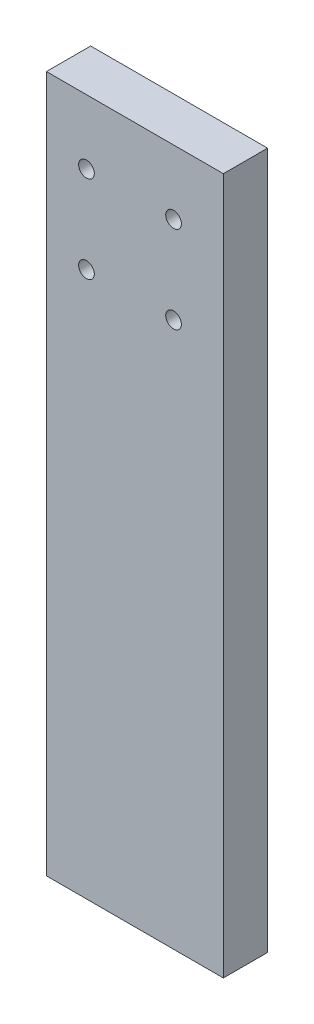
ISO-10303-21;
HEADER;
FILE_DESCRIPTION(('STEP AP214'),'2;1');
FILE_NAME('part.step','',(''),(''),'','','');
FILE_SCHEMA(('AUTOMOTIVE_DESIGN { 1 0 10303 214 1 1 1 1 }'));
ENDSEC;
DATA;
#1=APPLICATION_CONTEXT('core data for automotive mechanical design processes');
#2=APPLICATION_PROTOCOL_DEFINITION('international standard','automotive_design',2000,#1);
#3=PRODUCT_CONTEXT('',#1,'mechanical');
#4=PRODUCT('Part','Part','',(#3));
#5=PRODUCT_RELATED_PRODUCT_CATEGORY('part','',(#4));
#6=PRODUCT_DEFINITION_FORMATION('','',#4);
#7=PRODUCT_DEFINITION_CONTEXT('part definition',#1,'design');
#8=PRODUCT_DEFINITION('design','',#6,#7);
#9=PRODUCT_DEFINITION_SHAPE('','',#8);
#10=(LENGTH_UNIT() NAMED_UNIT(*) SI_UNIT(.MILLI.,.METRE.));
#11=(NAMED_UNIT(*) PLANE_ANGLE_UNIT() SI_UNIT($,.RADIAN.));
#12=(NAMED_UNIT(*) SI_UNIT($,.STERADIAN.) SOLID_ANGLE_UNIT());
#13=UNCERTAINTY_MEASURE_WITH_UNIT(LENGTH_MEASURE(1.E-05),#10,'distance_accuracy_value','');
#14=(GEOMETRIC_REPRESENTATION_CONTEXT(3) GLOBAL_UNCERTAINTY_ASSIGNED_CONTEXT((#13)) GLOBAL_UNIT_ASSIGNED_CONTEXT((#10,
#11,#12)) REPRESENTATION_CONTEXT('',''));
#15=CARTESIAN_POINT('',(0.,0.,0.));
#16=DIRECTION('',(0.,0.,1.));
#17=DIRECTION('',(1.,0.,0.));
#18=AXIS2_PLACEMENT_3D('',#15,#16,#17);
#19=CARTESIAN_POINT('',(26.8,0.,12.7));
#20=DIRECTION('',(1.,0.,0.));
#21=DIRECTION('',(0.,1.,0.));
#22=AXIS2_PLACEMENT_3D('',#19,#20,#21);
#23=PLANE('',#22);
#24=DIRECTION('',(0.,-1.,0.));
#25=VECTOR('',#24,1.);
#26=CARTESIAN_POINT('',(26.8,0.,0.));
#27=LINE('',#26,#25);
#28=CARTESIAN_POINT('',(26.8,62.,0.));
#29=VERTEX_POINT('',#28);
#30=CARTESIAN_POINT('',(26.8,-138.,0.));
#31=VERTEX_POINT('',#30);
#32=EDGE_CURVE('E115',#29,#31,#27,.T.);
#33=ORIENTED_EDGE('',*,*,#32,.F.);
#34=DIRECTION('',(0.,0.,-1.));
#35=VECTOR('',#34,1.);
#36=CARTESIAN_POINT('',(26.8,62.,12.7));
#37=LINE('',#36,#35);
#38=CARTESIAN_POINT('',(26.8,62.,12.7));
#39=VERTEX_POINT('',#38);
#40=EDGE_CURVE('E11',#39,#29,#37,.T.);
#41=ORIENTED_EDGE('',*,*,#40,.F.);
#42=DIRECTION('',(0.,-1.,0.));
#43=VECTOR('',#42,1.);
#44=CARTESIAN_POINT('',(26.8,0.,12.7));
#45=LINE('',#44,#43);
#46=CARTESIAN_POINT('',(26.8,-138.,12.7));
#47=VERTEX_POINT('',#46);
#48=EDGE_CURVE('E95',#39,#47,#45,.T.);
#49=ORIENTED_EDGE('',*,*,#48,.T.);
#50=DIRECTION('',(0.,0.,-1.));
#51=VECTOR('',#50,1.);
#52=CARTESIAN_POINT('',(26.8,-138.,12.7));
#53=LINE('',#52,#51);
#54=EDGE_CURVE('E74',#47,#31,#53,.T.);
#55=ORIENTED_EDGE('',*,*,#54,.T.);
#56=EDGE_LOOP('',(#33,#41,#49,#55));
#57=FACE_BOUND('',#56,.T.);
#58=ADVANCED_FACE('F34',(#57),#23,.T.);
#59=CARTESIAN_POINT('',(0.,62.,12.7));
#60=DIRECTION('',(0.,1.,0.));
#61=DIRECTION('',(0.,0.,1.));
#62=AXIS2_PLACEMENT_3D('',#59,#60,#61);
#63=PLANE('',#62);
#64=DIRECTION('',(1.,0.,0.));
#65=VECTOR('',#64,1.);
#66=CARTESIAN_POINT('',(0.,62.,0.));
#67=LINE('',#66,#65);
#68=CARTESIAN_POINT('',(-24.,62.,0.));
#69=VERTEX_POINT('',#68);
#70=EDGE_CURVE('E86',#69,#29,#67,.T.);
#71=ORIENTED_EDGE('',*,*,#70,.F.);
#72=DIRECTION('',(0.,0.,-1.));
#73=VECTOR('',#72,1.);
#74=CARTESIAN_POINT('',(-24.,62.,12.7));
#75=LINE('',#74,#73);
#76=CARTESIAN_POINT('',(-24.,62.,12.7));
#77=VERTEX_POINT('',#76);
#78=EDGE_CURVE('E43',#77,#69,#75,.T.);
#79=ORIENTED_EDGE('',*,*,#78,.F.);
#80=DIRECTION('',(1.,0.,0.));
#81=VECTOR('',#80,1.);
#82=CARTESIAN_POINT('',(0.,62.,12.7));
#83=LINE('',#82,#81);
#84=EDGE_CURVE('E84',#77,#39,#83,.T.);
#85=ORIENTED_EDGE('',*,*,#84,.T.);
#86=ORIENTED_EDGE('',*,*,#40,.T.);
#87=EDGE_LOOP('',(#71,#79,#85,#86));
#88=FACE_BOUND('',#87,.T.);
#89=ADVANCED_FACE('F82',(#88),#63,.T.);
#90=CARTESIAN_POINT('',(-24.,0.,12.7));
#91=DIRECTION('',(1.,0.,0.));
#92=DIRECTION('',(0.,1.,0.));
#93=AXIS2_PLACEMENT_3D('',#90,#91,#92);
#94=PLANE('',#93);
#95=DIRECTION('',(0.,-1.,0.));
#96=VECTOR('',#95,1.);
#97=CARTESIAN_POINT('',(-24.,0.,0.));
#98=LINE('',#97,#96);
#99=CARTESIAN_POINT('',(-24.,-138.,0.));
#100=VERTEX_POINT('',#99);
#101=EDGE_CURVE('E118',#69,#100,#98,.T.);
#102=ORIENTED_EDGE('',*,*,#101,.T.);
#103=DIRECTION('',(0.,0.,-1.));
#104=VECTOR('',#103,1.);
#105=CARTESIAN_POINT('',(-24.,-138.,12.7));
#106=LINE('',#105,#104);
#107=CARTESIAN_POINT('',(-24.,-138.,12.7));
#108=VERTEX_POINT('',#107);
#109=EDGE_CURVE('E89',#108,#100,#106,.T.);
#110=ORIENTED_EDGE('',*,*,#109,.F.);
#111=DIRECTION('',(0.,-1.,0.));
#112=VECTOR('',#111,1.);
#113=CARTESIAN_POINT('',(-24.,0.,12.7));
#114=LINE('',#113,#112);
#115=EDGE_CURVE('E91',#77,#108,#114,.T.);
#116=ORIENTED_EDGE('',*,*,#115,.F.);
#117=ORIENTED_EDGE('',*,*,#78,.T.);
#118=EDGE_LOOP('',(#102,#110,#116,#117));
#119=FACE_BOUND('',#118,.T.);
#120=ADVANCED_FACE('F92',(#119),#94,.F.);
#121=CARTESIAN_POINT('',(-12.5,18.5,12.7));
#122=DIRECTION('',(0.,0.,-1.));
#123=DIRECTION('',(-1.,0.,0.));
#124=AXIS2_PLACEMENT_3D('',#121,#122,#123);
#125=CYLINDRICAL_SURFACE('',#124,2.25);
#126=CARTESIAN_POINT('',(-12.5,18.5,12.7));
#127=DIRECTION('',(0.,0.,1.));
#128=DIRECTION('',(1.,0.,0.));
#129=AXIS2_PLACEMENT_3D('',#126,#127,#128);
#130=CIRCLE('',#129,2.25);
#131=CARTESIAN_POINT('',(-10.25,18.5,12.7));
#132=VERTEX_POINT('',#131);
#133=EDGE_CURVE('E97',#132,#132,#130,.T.);
#134=ORIENTED_EDGE('',*,*,#133,.T.);
#135=EDGE_LOOP('',(#134));
#136=FACE_BOUND('',#135,.T.);
#137=CARTESIAN_POINT('',(-12.5,18.5,0.));
#138=DIRECTION('',(0.,0.,1.));
#139=DIRECTION('',(1.,0.,0.));
#140=AXIS2_PLACEMENT_3D('',#137,#138,#139);
#141=CIRCLE('',#140,2.25);
#142=CARTESIAN_POINT('',(-10.25,18.5,0.));
#143=VERTEX_POINT('',#142);
#144=EDGE_CURVE('E112',#143,#143,#141,.T.);
#145=ORIENTED_EDGE('',*,*,#144,.F.);
#146=EDGE_LOOP('',(#145));
#147=FACE_BOUND('',#146,.T.);
#148=ADVANCED_FACE('F134',(#136,#147),#125,.F.);
#149=CARTESIAN_POINT('',(12.5,18.5,12.7));
#150=DIRECTION('',(0.,0.,-1.));
#151=DIRECTION('',(-1.,0.,0.));
#152=AXIS2_PLACEMENT_3D('',#149,#150,#151);
#153=CYLINDRICAL_SURFACE('',#152,2.25);
#154=CARTESIAN_POINT('',(12.5,18.5,12.7));
#155=DIRECTION('',(0.,0.,1.));
#156=DIRECTION('',(1.,0.,0.));
#157=AXIS2_PLACEMENT_3D('',#154,#155,#156);
#158=CIRCLE('',#157,2.25);
#159=CARTESIAN_POINT('',(14.75,18.5,12.7));
#160=VERTEX_POINT('',#159);
#161=EDGE_CURVE('E268',#160,#160,#158,.T.);
#162=ORIENTED_EDGE('',*,*,#161,.T.);
#163=EDGE_LOOP('',(#162));
#164=FACE_BOUND('',#163,.T.);
#165=CARTESIAN_POINT('',(12.5,18.5,0.));
#166=DIRECTION('',(0.,0.,1.));
#167=DIRECTION('',(1.,0.,0.));
#168=AXIS2_PLACEMENT_3D('',#165,#166,#167);
#169=CIRCLE('',#168,2.25);
#170=CARTESIAN_POINT('',(14.75,18.5,0.));
#171=VERTEX_POINT('',#170);
#172=EDGE_CURVE('E109',#171,#171,#169,.T.);
#173=ORIENTED_EDGE('',*,*,#172,.F.);
#174=EDGE_LOOP('',(#173));
#175=FACE_BOUND('',#174,.T.);
#176=ADVANCED_FACE('F137',(#164,#175),#153,.F.);
#177=CARTESIAN_POINT('',(12.5,43.5,12.7));
#178=DIRECTION('',(0.,0.,-1.));
#179=DIRECTION('',(-1.,0.,0.));
#180=AXIS2_PLACEMENT_3D('',#177,#178,#179);
#181=CYLINDRICAL_SURFACE('',#180,2.25);
#182=CARTESIAN_POINT('',(12.5,43.5,12.7));
#183=DIRECTION('',(0.,0.,1.));
#184=DIRECTION('',(1.,0.,0.));
#185=AXIS2_PLACEMENT_3D('',#182,#183,#184);
#186=CIRCLE('',#185,2.25);
#187=CARTESIAN_POINT('',(14.75,43.5,12.7));
#188=VERTEX_POINT('',#187);
#189=EDGE_CURVE('E151',#188,#188,#186,.T.);
#190=ORIENTED_EDGE('',*,*,#189,.T.);
#191=EDGE_LOOP('',(#190));
#192=FACE_BOUND('',#191,.T.);
#193=CARTESIAN_POINT('',(12.5,43.5,0.));
#194=DIRECTION('',(0.,0.,1.));
#195=DIRECTION('',(1.,0.,0.));
#196=AXIS2_PLACEMENT_3D('',#193,#194,#195);
#197=CIRCLE('',#196,2.25);
#198=CARTESIAN_POINT('',(14.75,43.5,0.));
#199=VERTEX_POINT('',#198);
#200=EDGE_CURVE('E105',#199,#199,#197,.T.);
#201=ORIENTED_EDGE('',*,*,#200,.F.);
#202=EDGE_LOOP('',(#201));
#203=FACE_BOUND('',#202,.T.);
#204=ADVANCED_FACE('F140',(#192,#203),#181,.F.);
#205=CARTESIAN_POINT('',(-12.5,43.5,12.7));
#206=DIRECTION('',(0.,0.,-1.));
#207=DIRECTION('',(-1.,0.,0.));
#208=AXIS2_PLACEMENT_3D('',#205,#206,#207);
#209=CYLINDRICAL_SURFACE('',#208,2.25);
#210=CARTESIAN_POINT('',(-12.5,43.5,12.7));
#211=DIRECTION('',(0.,0.,1.));
#212=DIRECTION('',(1.,0.,0.));
#213=AXIS2_PLACEMENT_3D('',#210,#211,#212);
#214=CIRCLE('',#213,2.25);
#215=CARTESIAN_POINT('',(-10.25,43.5,12.7));
#216=VERTEX_POINT('',#215);
#217=EDGE_CURVE('E121',#216,#216,#214,.T.);
#218=ORIENTED_EDGE('',*,*,#217,.T.);
#219=EDGE_LOOP('',(#218));
#220=FACE_BOUND('',#219,.T.);
#221=CARTESIAN_POINT('',(-12.5,43.5,0.));
#222=DIRECTION('',(0.,0.,1.));
#223=DIRECTION('',(1.,0.,0.));
#224=AXIS2_PLACEMENT_3D('',#221,#222,#223);
#225=CIRCLE('',#224,2.25);
#226=CARTESIAN_POINT('',(-10.25,43.5,0.));
#227=VERTEX_POINT('',#226);
#228=EDGE_CURVE('E102',#227,#227,#225,.T.);
#229=ORIENTED_EDGE('',*,*,#228,.F.);
#230=EDGE_LOOP('',(#229));
#231=FACE_BOUND('',#230,.T.);
#232=ADVANCED_FACE('F36',(#220,#231),#209,.F.);
#233=CARTESIAN_POINT('',(0.,-138.,12.7));
#234=DIRECTION('',(0.,1.,0.));
#235=DIRECTION('',(0.,0.,1.));
#236=AXIS2_PLACEMENT_3D('',#233,#234,#235);
#237=PLANE('',#236);
#238=CARTESIAN_POINT('',(18.9,-138.,6.35));
#239=DIRECTION('',(0.,-1.,0.));
#240=DIRECTION('',(0.,0.,-1.));
#241=AXIS2_PLACEMENT_3D('',#238,#239,#240);
#242=CIRCLE('',#241,1.5);
#243=CARTESIAN_POINT('',(18.9,-138.,4.85));
#244=VERTEX_POINT('',#243);
#245=EDGE_CURVE('E256',#244,#244,#242,.T.);
#246=ORIENTED_EDGE('',*,*,#245,.F.);
#247=EDGE_LOOP('',(#246));
#248=FACE_BOUND('',#247,.T.);
#249=CARTESIAN_POINT('',(-16.1,-138.,6.35));
#250=DIRECTION('',(0.,-1.,0.));
#251=DIRECTION('',(0.,0.,-1.));
#252=AXIS2_PLACEMENT_3D('',#249,#250,#251);
#253=CIRCLE('',#252,1.5);
#254=CARTESIAN_POINT('',(-16.1,-138.,4.85));
#255=VERTEX_POINT('',#254);
#256=EDGE_CURVE('E255',#255,#255,#253,.T.);
#257=ORIENTED_EDGE('',*,*,#256,.F.);
#258=EDGE_LOOP('',(#257));
#259=FACE_BOUND('',#258,.T.);
#260=DIRECTION('',(1.,0.,0.));
#261=VECTOR('',#260,1.);
#262=CARTESIAN_POINT('',(0.,-138.,0.));
#263=LINE('',#262,#261);
#264=EDGE_CURVE('E67',#100,#31,#263,.T.);
#265=ORIENTED_EDGE('',*,*,#264,.T.);
#266=ORIENTED_EDGE('',*,*,#54,.F.);
#267=DIRECTION('',(1.,0.,0.));
#268=VECTOR('',#267,1.);
#269=CARTESIAN_POINT('',(0.,-138.,12.7));
#270=LINE('',#269,#268);
#271=EDGE_CURVE('E51',#108,#47,#270,.T.);
#272=ORIENTED_EDGE('',*,*,#271,.F.);
#273=ORIENTED_EDGE('',*,*,#109,.T.);
#274=EDGE_LOOP('',(#265,#266,#272,#273));
#275=FACE_BOUND('',#274,.T.);
#276=ADVANCED_FACE('F124',(#248,#259,#275),#237,.F.);
#277=CARTESIAN_POINT('',(0.,0.,12.7));
#278=DIRECTION('',(0.,0.,1.));
#279=DIRECTION('',(1.,0.,0.));
#280=AXIS2_PLACEMENT_3D('',#277,#278,#279);
#281=PLANE('',#280);
#282=ORIENTED_EDGE('',*,*,#217,.F.);
#283=EDGE_LOOP('',(#282));
#284=FACE_BOUND('',#283,.T.);
#285=ORIENTED_EDGE('',*,*,#189,.F.);
#286=EDGE_LOOP('',(#285));
#287=FACE_BOUND('',#286,.T.);
#288=ORIENTED_EDGE('',*,*,#161,.F.);
#289=EDGE_LOOP('',(#288));
#290=FACE_BOUND('',#289,.T.);
#291=ORIENTED_EDGE('',*,*,#133,.F.);
#292=EDGE_LOOP('',(#291));
#293=FACE_BOUND('',#292,.T.);
#294=ORIENTED_EDGE('',*,*,#48,.F.);
#295=ORIENTED_EDGE('',*,*,#84,.F.);
#296=ORIENTED_EDGE('',*,*,#115,.T.);
#297=ORIENTED_EDGE('',*,*,#271,.T.);
#298=EDGE_LOOP('',(#294,#295,#296,#297));
#299=FACE_BOUND('',#298,.T.);
#300=ADVANCED_FACE('F94',(#284,#287,#290,#293,#299),#281,.T.);
#301=CARTESIAN_POINT('',(0.,0.,0.));
#302=DIRECTION('',(0.,0.,1.));
#303=DIRECTION('',(1.,0.,0.));
#304=AXIS2_PLACEMENT_3D('',#301,#302,#303);
#305=PLANE('',#304);
#306=ORIENTED_EDGE('',*,*,#228,.T.);
#307=EDGE_LOOP('',(#306));
#308=FACE_BOUND('',#307,.T.);
#309=ORIENTED_EDGE('',*,*,#200,.T.);
#310=EDGE_LOOP('',(#309));
#311=FACE_BOUND('',#310,.T.);
#312=ORIENTED_EDGE('',*,*,#172,.T.);
#313=EDGE_LOOP('',(#312));
#314=FACE_BOUND('',#313,.T.);
#315=ORIENTED_EDGE('',*,*,#144,.T.);
#316=EDGE_LOOP('',(#315));
#317=FACE_BOUND('',#316,.T.);
#318=ORIENTED_EDGE('',*,*,#32,.T.);
#319=ORIENTED_EDGE('',*,*,#264,.F.);
#320=ORIENTED_EDGE('',*,*,#101,.F.);
#321=ORIENTED_EDGE('',*,*,#70,.T.);
#322=EDGE_LOOP('',(#318,#319,#320,#321));
#323=FACE_BOUND('',#322,.T.);
#324=ADVANCED_FACE('F125',(#308,#311,#314,#317,#323),#305,.F.);
#325=CARTESIAN_POINT('',(-16.1,-118.,6.35));
#326=DIRECTION('',(0.,-1.,0.));
#327=DIRECTION('',(0.,0.,-1.));
#328=AXIS2_PLACEMENT_3D('',#325,#326,#327);
#329=CYLINDRICAL_SURFACE('',#328,1.5);
#330=CARTESIAN_POINT('',(-16.1,-118.,6.35));
#331=DIRECTION('',(0.,-1.,0.));
#332=DIRECTION('',(0.,0.,-1.));
#333=AXIS2_PLACEMENT_3D('',#330,#331,#332);
#334=CIRCLE('',#333,1.5);
#335=CARTESIAN_POINT('',(-16.1,-118.,4.85));
#336=VERTEX_POINT('',#335);
#337=EDGE_CURVE('E106',#336,#336,#334,.T.);
#338=ORIENTED_EDGE('',*,*,#337,.F.);
#339=EDGE_LOOP('',(#338));
#340=FACE_BOUND('',#339,.T.);
#341=ORIENTED_EDGE('',*,*,#256,.T.);
#342=EDGE_LOOP('',(#341));
#343=FACE_BOUND('',#342,.T.);
#344=ADVANCED_FACE('F156',(#340,#343),#329,.F.);
#345=CARTESIAN_POINT('',(-16.1,-118.,6.35));
#346=DIRECTION('',(0.,-1.,0.));
#347=DIRECTION('',(0.,0.,-1.));
#348=AXIS2_PLACEMENT_3D('',#345,#346,#347);
#349=PLANE('',#348);
#350=ORIENTED_EDGE('',*,*,#337,.T.);
#351=EDGE_LOOP('',(#350));
#352=FACE_BOUND('',#351,.T.);
#353=ADVANCED_FACE('F168',(#352),#349,.T.);
#354=CARTESIAN_POINT('',(18.9,-118.,6.35));
#355=DIRECTION('',(0.,-1.,0.));
#356=DIRECTION('',(0.,0.,-1.));
#357=AXIS2_PLACEMENT_3D('',#354,#355,#356);
#358=CYLINDRICAL_SURFACE('',#357,1.5);
#359=CARTESIAN_POINT('',(18.9,-118.,6.35));
#360=DIRECTION('',(0.,-1.,0.));
#361=DIRECTION('',(0.,0.,-1.));
#362=AXIS2_PLACEMENT_3D('',#359,#360,#361);
#363=CIRCLE('',#362,1.5);
#364=CARTESIAN_POINT('',(18.9,-118.,4.85));
#365=VERTEX_POINT('',#364);
#366=EDGE_CURVE('E254',#365,#365,#363,.T.);
#367=ORIENTED_EDGE('',*,*,#366,.F.);
#368=EDGE_LOOP('',(#367));
#369=FACE_BOUND('',#368,.T.);
#370=ORIENTED_EDGE('',*,*,#245,.T.);
#371=EDGE_LOOP('',(#370));
#372=FACE_BOUND('',#371,.T.);
#373=ADVANCED_FACE('F228',(#369,#372),#358,.F.);
#374=CARTESIAN_POINT('',(18.9,-118.,6.35));
#375=DIRECTION('',(0.,-1.,0.));
#376=DIRECTION('',(0.,0.,-1.));
#377=AXIS2_PLACEMENT_3D('',#374,#375,#376);
#378=PLANE('',#377);
#379=ORIENTED_EDGE('',*,*,#366,.T.);
#380=EDGE_LOOP('',(#379));
#381=FACE_BOUND('',#380,.T.);
#382=ADVANCED_FACE('F238',(#381),#378,.T.);
#383=CLOSED_SHELL('',(#58,#89,#120,#148,#176,#204,#232,#276,#300,#324,#344,#353,#373,#382));
#384=MANIFOLD_SOLID_BREP('B2',#383);
#385=ADVANCED_BREP_SHAPE_REPRESENTATION('',(#18,#384),#14);
#386=SHAPE_DEFINITION_REPRESENTATION(#9,#385);
ENDSEC;
END-ISO-10303-21;
